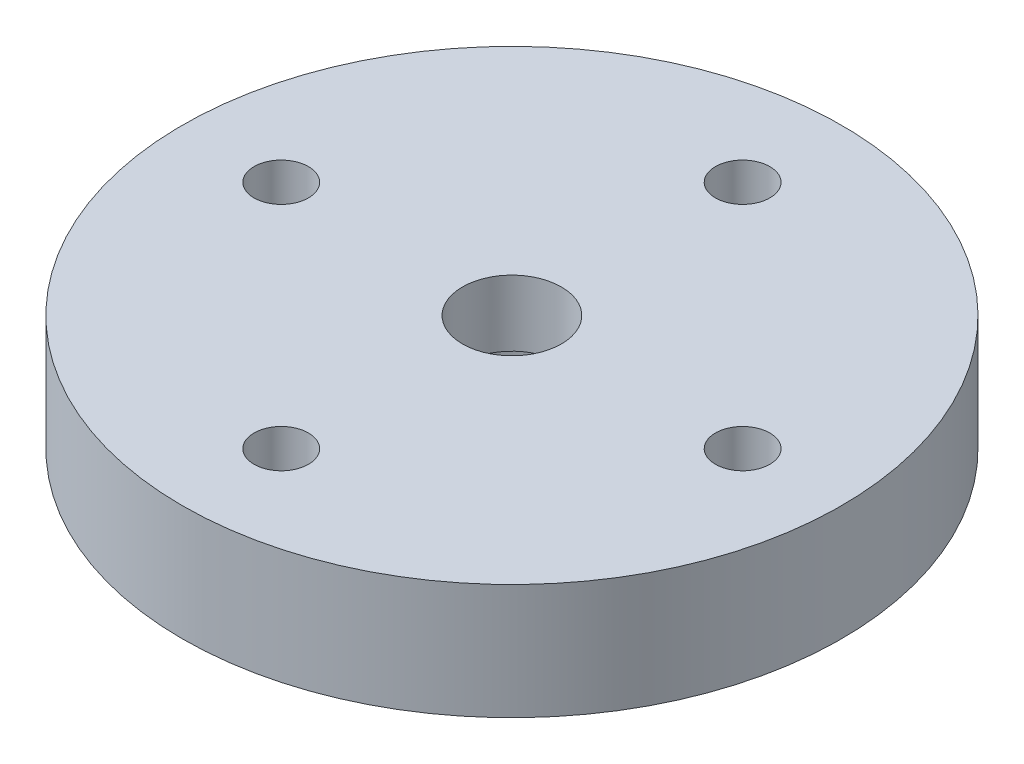
ISO-10303-21;
HEADER;
FILE_DESCRIPTION(('STEP AP214'),'2;1');
FILE_NAME('part.step','',(''),(''),'','','');
FILE_SCHEMA(('AUTOMOTIVE_DESIGN { 1 0 10303 214 1 1 1 1 }'));
ENDSEC;
DATA;
#1=APPLICATION_CONTEXT('core data for automotive mechanical design processes');
#2=APPLICATION_PROTOCOL_DEFINITION('international standard','automotive_design',2000,#1);
#3=PRODUCT_CONTEXT('',#1,'mechanical');
#4=PRODUCT('Part','Part','',(#3));
#5=PRODUCT_RELATED_PRODUCT_CATEGORY('part','',(#4));
#6=PRODUCT_DEFINITION_FORMATION('','',#4);
#7=PRODUCT_DEFINITION_CONTEXT('part definition',#1,'design');
#8=PRODUCT_DEFINITION('design','',#6,#7);
#9=PRODUCT_DEFINITION_SHAPE('','',#8);
#10=(LENGTH_UNIT() NAMED_UNIT(*) SI_UNIT(.MILLI.,.METRE.));
#11=(NAMED_UNIT(*) PLANE_ANGLE_UNIT() SI_UNIT($,.RADIAN.));
#12=(NAMED_UNIT(*) SI_UNIT($,.STERADIAN.) SOLID_ANGLE_UNIT());
#13=UNCERTAINTY_MEASURE_WITH_UNIT(LENGTH_MEASURE(1.E-05),#10,'distance_accuracy_value','');
#14=(GEOMETRIC_REPRESENTATION_CONTEXT(3) GLOBAL_UNCERTAINTY_ASSIGNED_CONTEXT((#13)) GLOBAL_UNIT_ASSIGNED_CONTEXT((#10,
#11,#12)) REPRESENTATION_CONTEXT('',''));
#15=CARTESIAN_POINT('',(0.,0.,0.));
#16=DIRECTION('',(0.,0.,1.));
#17=DIRECTION('',(1.,0.,0.));
#18=AXIS2_PLACEMENT_3D('',#15,#16,#17);
#19=CARTESIAN_POINT('',(0.,3.5,0.));
#20=DIRECTION('',(0.,-1.,0.));
#21=DIRECTION('',(0.,0.,-1.));
#22=AXIS2_PLACEMENT_3D('',#19,#20,#21);
#23=CYLINDRICAL_SURFACE('',#22,1.5);
#24=CARTESIAN_POINT('',(0.,3.5,0.));
#25=DIRECTION('',(0.,1.,0.));
#26=DIRECTION('',(0.,0.,1.));
#27=AXIS2_PLACEMENT_3D('',#24,#25,#26);
#28=CIRCLE('',#27,1.5);
#29=CARTESIAN_POINT('',(0.,3.5,1.5));
#30=VERTEX_POINT('',#29);
#31=EDGE_CURVE('E70',#30,#30,#28,.T.);
#32=ORIENTED_EDGE('',*,*,#31,.T.);
#33=EDGE_LOOP('',(#32));
#34=FACE_BOUND('',#33,.T.);
#35=CARTESIAN_POINT('',(0.,1.5,0.));
#36=DIRECTION('',(0.,-1.,0.));
#37=DIRECTION('',(0.,0.,-1.));
#38=AXIS2_PLACEMENT_3D('',#35,#36,#37);
#39=CIRCLE('',#38,1.5);
#40=CARTESIAN_POINT('',(0.,1.5,-1.5));
#41=VERTEX_POINT('',#40);
#42=EDGE_CURVE('E62',#41,#41,#39,.T.);
#43=ORIENTED_EDGE('',*,*,#42,.T.);
#44=EDGE_LOOP('',(#43));
#45=FACE_BOUND('',#44,.T.);
#46=ADVANCED_FACE('F43',(#34,#45),#23,.F.);
#47=CARTESIAN_POINT('',(0.,0.,0.));
#48=DIRECTION('',(0.,1.,0.));
#49=DIRECTION('',(0.,0.,1.));
#50=AXIS2_PLACEMENT_3D('',#47,#48,#49);
#51=PLANE('',#50);
#52=CARTESIAN_POINT('',(-7.,0.,0.));
#53=DIRECTION('',(0.,1.,0.));
#54=DIRECTION('',(0.,0.,1.));
#55=AXIS2_PLACEMENT_3D('',#52,#53,#54);
#56=CIRCLE('',#55,0.825);
#57=CARTESIAN_POINT('',(-7.,0.,0.824999999999927));
#58=VERTEX_POINT('',#57);
#59=EDGE_CURVE('E94',#58,#58,#56,.T.);
#60=ORIENTED_EDGE('',*,*,#59,.T.);
#61=EDGE_LOOP('',(#60));
#62=FACE_BOUND('',#61,.T.);
#63=CARTESIAN_POINT('',(0.,0.,7.));
#64=DIRECTION('',(0.,1.,0.));
#65=DIRECTION('',(0.,0.,1.));
#66=AXIS2_PLACEMENT_3D('',#63,#64,#65);
#67=CIRCLE('',#66,0.825);
#68=CARTESIAN_POINT('',(0.,0.,7.825));
#69=VERTEX_POINT('',#68);
#70=EDGE_CURVE('E88',#69,#69,#67,.T.);
#71=ORIENTED_EDGE('',*,*,#70,.T.);
#72=EDGE_LOOP('',(#71));
#73=FACE_BOUND('',#72,.T.);
#74=CARTESIAN_POINT('',(7.,0.,0.));
#75=DIRECTION('',(0.,1.,0.));
#76=DIRECTION('',(0.,0.,1.));
#77=AXIS2_PLACEMENT_3D('',#74,#75,#76);
#78=CIRCLE('',#77,0.825);
#79=CARTESIAN_POINT('',(7.,0.,0.825000000000024));
#80=VERTEX_POINT('',#79);
#81=EDGE_CURVE('E82',#80,#80,#78,.T.);
#82=ORIENTED_EDGE('',*,*,#81,.T.);
#83=EDGE_LOOP('',(#82));
#84=FACE_BOUND('',#83,.T.);
#85=CARTESIAN_POINT('',(0.,0.,-7.));
#86=DIRECTION('',(0.,1.,0.));
#87=DIRECTION('',(0.,0.,1.));
#88=AXIS2_PLACEMENT_3D('',#85,#86,#87);
#89=CIRCLE('',#88,0.825);
#90=CARTESIAN_POINT('',(0.,0.,-6.175));
#91=VERTEX_POINT('',#90);
#92=EDGE_CURVE('E76',#91,#91,#89,.T.);
#93=ORIENTED_EDGE('',*,*,#92,.T.);
#94=EDGE_LOOP('',(#93));
#95=FACE_BOUND('',#94,.T.);
#96=CARTESIAN_POINT('',(0.,0.,0.));
#97=DIRECTION('',(0.,1.,0.));
#98=DIRECTION('',(0.,0.,1.));
#99=AXIS2_PLACEMENT_3D('',#96,#97,#98);
#100=CIRCLE('',#99,10.);
#101=CARTESIAN_POINT('',(0.,0.,10.));
#102=VERTEX_POINT('',#101);
#103=EDGE_CURVE('E67',#102,#102,#100,.T.);
#104=ORIENTED_EDGE('',*,*,#103,.F.);
#105=EDGE_LOOP('',(#104));
#106=FACE_BOUND('',#105,.T.);
#107=CARTESIAN_POINT('',(0.,0.,0.));
#108=DIRECTION('',(0.,1.,0.));
#109=DIRECTION('',(0.,0.,1.));
#110=AXIS2_PLACEMENT_3D('',#107,#108,#109);
#111=CIRCLE('',#110,4.5);
#112=CARTESIAN_POINT('',(0.,0.,4.5));
#113=VERTEX_POINT('',#112);
#114=EDGE_CURVE('E55',#113,#113,#111,.F.);
#115=ORIENTED_EDGE('',*,*,#114,.F.);
#116=EDGE_LOOP('',(#115));
#117=FACE_BOUND('',#116,.T.);
#118=ADVANCED_FACE('F123',(#62,#73,#84,#95,#106,#117),#51,.F.);
#119=CARTESIAN_POINT('',(0.,3.5,0.));
#120=DIRECTION('',(0.,1.,0.));
#121=DIRECTION('',(0.,0.,1.));
#122=AXIS2_PLACEMENT_3D('',#119,#120,#121);
#123=PLANE('',#122);
#124=CARTESIAN_POINT('',(0.,3.5,7.));
#125=DIRECTION('',(0.,1.,0.));
#126=DIRECTION('',(0.,0.,1.));
#127=AXIS2_PLACEMENT_3D('',#124,#125,#126);
#128=CIRCLE('',#127,0.825);
#129=CARTESIAN_POINT('',(0.,3.5,7.825));
#130=VERTEX_POINT('',#129);
#131=EDGE_CURVE('E85',#130,#130,#128,.T.);
#132=ORIENTED_EDGE('',*,*,#131,.F.);
#133=EDGE_LOOP('',(#132));
#134=FACE_BOUND('',#133,.T.);
#135=CARTESIAN_POINT('',(0.,3.5,-7.));
#136=DIRECTION('',(0.,1.,0.));
#137=DIRECTION('',(0.,0.,1.));
#138=AXIS2_PLACEMENT_3D('',#135,#136,#137);
#139=CIRCLE('',#138,0.825);
#140=CARTESIAN_POINT('',(0.,3.5,-6.175));
#141=VERTEX_POINT('',#140);
#142=EDGE_CURVE('E75',#141,#141,#139,.T.);
#143=ORIENTED_EDGE('',*,*,#142,.F.);
#144=EDGE_LOOP('',(#143));
#145=FACE_BOUND('',#144,.T.);
#146=CARTESIAN_POINT('',(0.,3.5,0.));
#147=DIRECTION('',(0.,1.,0.));
#148=DIRECTION('',(0.,0.,1.));
#149=AXIS2_PLACEMENT_3D('',#146,#147,#148);
#150=CIRCLE('',#149,10.);
#151=CARTESIAN_POINT('',(0.,3.5,10.));
#152=VERTEX_POINT('',#151);
#153=EDGE_CURVE('E59',#152,#152,#150,.T.);
#154=ORIENTED_EDGE('',*,*,#153,.T.);
#155=EDGE_LOOP('',(#154));
#156=FACE_BOUND('',#155,.T.);
#157=ORIENTED_EDGE('',*,*,#31,.F.);
#158=EDGE_LOOP('',(#157));
#159=FACE_BOUND('',#158,.T.);
#160=CARTESIAN_POINT('',(7.,3.5,0.));
#161=DIRECTION('',(0.,1.,0.));
#162=DIRECTION('',(0.,0.,1.));
#163=AXIS2_PLACEMENT_3D('',#160,#161,#162);
#164=CIRCLE('',#163,0.825);
#165=CARTESIAN_POINT('',(7.,3.5,0.825000000000024));
#166=VERTEX_POINT('',#165);
#167=EDGE_CURVE('E79',#166,#166,#164,.T.);
#168=ORIENTED_EDGE('',*,*,#167,.F.);
#169=EDGE_LOOP('',(#168));
#170=FACE_BOUND('',#169,.T.);
#171=CARTESIAN_POINT('',(-7.,3.5,0.));
#172=DIRECTION('',(0.,1.,0.));
#173=DIRECTION('',(0.,0.,1.));
#174=AXIS2_PLACEMENT_3D('',#171,#172,#173);
#175=CIRCLE('',#174,0.825);
#176=CARTESIAN_POINT('',(-7.,3.5,0.824999999999927));
#177=VERTEX_POINT('',#176);
#178=EDGE_CURVE('E91',#177,#177,#175,.T.);
#179=ORIENTED_EDGE('',*,*,#178,.F.);
#180=EDGE_LOOP('',(#179));
#181=FACE_BOUND('',#180,.T.);
#182=ADVANCED_FACE('F129',(#134,#145,#156,#159,#170,#181),#123,.T.);
#183=CARTESIAN_POINT('',(0.,3.5,0.));
#184=DIRECTION('',(0.,-1.,0.));
#185=DIRECTION('',(0.,0.,-1.));
#186=AXIS2_PLACEMENT_3D('',#183,#184,#185);
#187=CYLINDRICAL_SURFACE('',#186,10.);
#188=ORIENTED_EDGE('',*,*,#153,.F.);
#189=EDGE_LOOP('',(#188));
#190=FACE_BOUND('',#189,.T.);
#191=ORIENTED_EDGE('',*,*,#103,.T.);
#192=EDGE_LOOP('',(#191));
#193=FACE_BOUND('',#192,.T.);
#194=ADVANCED_FACE('F138',(#190,#193),#187,.T.);
#195=CARTESIAN_POINT('',(0.,3.5,-7.));
#196=DIRECTION('',(0.,-1.,0.));
#197=DIRECTION('',(0.,0.,-1.));
#198=AXIS2_PLACEMENT_3D('',#195,#196,#197);
#199=CYLINDRICAL_SURFACE('',#198,0.825);
#200=ORIENTED_EDGE('',*,*,#142,.T.);
#201=EDGE_LOOP('',(#200));
#202=FACE_BOUND('',#201,.T.);
#203=ORIENTED_EDGE('',*,*,#92,.F.);
#204=EDGE_LOOP('',(#203));
#205=FACE_BOUND('',#204,.T.);
#206=ADVANCED_FACE('F135',(#202,#205),#199,.F.);
#207=CARTESIAN_POINT('',(7.,3.5,0.));
#208=DIRECTION('',(0.,-1.,0.));
#209=DIRECTION('',(0.,0.,-1.));
#210=AXIS2_PLACEMENT_3D('',#207,#208,#209);
#211=CYLINDRICAL_SURFACE('',#210,0.825);
#212=ORIENTED_EDGE('',*,*,#167,.T.);
#213=EDGE_LOOP('',(#212));
#214=FACE_BOUND('',#213,.T.);
#215=ORIENTED_EDGE('',*,*,#81,.F.);
#216=EDGE_LOOP('',(#215));
#217=FACE_BOUND('',#216,.T.);
#218=ADVANCED_FACE('F145',(#214,#217),#211,.F.);
#219=CARTESIAN_POINT('',(0.,3.5,7.));
#220=DIRECTION('',(0.,-1.,0.));
#221=DIRECTION('',(0.,0.,-1.));
#222=AXIS2_PLACEMENT_3D('',#219,#220,#221);
#223=CYLINDRICAL_SURFACE('',#222,0.825);
#224=ORIENTED_EDGE('',*,*,#131,.T.);
#225=EDGE_LOOP('',(#224));
#226=FACE_BOUND('',#225,.T.);
#227=ORIENTED_EDGE('',*,*,#70,.F.);
#228=EDGE_LOOP('',(#227));
#229=FACE_BOUND('',#228,.T.);
#230=ADVANCED_FACE('F165',(#226,#229),#223,.F.);
#231=CARTESIAN_POINT('',(-7.,3.5,0.));
#232=DIRECTION('',(0.,-1.,0.));
#233=DIRECTION('',(0.,0.,-1.));
#234=AXIS2_PLACEMENT_3D('',#231,#232,#233);
#235=CYLINDRICAL_SURFACE('',#234,0.825);
#236=ORIENTED_EDGE('',*,*,#178,.T.);
#237=EDGE_LOOP('',(#236));
#238=FACE_BOUND('',#237,.T.);
#239=ORIENTED_EDGE('',*,*,#59,.F.);
#240=EDGE_LOOP('',(#239));
#241=FACE_BOUND('',#240,.T.);
#242=ADVANCED_FACE('F162',(#238,#241),#235,.F.);
#243=CARTESIAN_POINT('',(0.,-2.,0.));
#244=DIRECTION('',(0.,-1.,0.));
#245=DIRECTION('',(0.,0.,-1.));
#246=AXIS2_PLACEMENT_3D('',#243,#244,#245);
#247=PLANE('',#246);
#248=CARTESIAN_POINT('',(0.,-2.,0.));
#249=DIRECTION('',(0.,-1.,0.));
#250=DIRECTION('',(0.,0.,-1.));
#251=AXIS2_PLACEMENT_3D('',#248,#249,#250);
#252=CIRCLE('',#251,3.5);
#253=CARTESIAN_POINT('',(0.,-2.,-3.5));
#254=VERTEX_POINT('',#253);
#255=EDGE_CURVE('E10',#254,#254,#252,.F.);
#256=ORIENTED_EDGE('',*,*,#255,.T.);
#257=EDGE_LOOP('',(#256));
#258=FACE_BOUND('',#257,.T.);
#259=CARTESIAN_POINT('',(0.,-2.,0.));
#260=DIRECTION('',(0.,-1.,0.));
#261=DIRECTION('',(0.,0.,-1.));
#262=AXIS2_PLACEMENT_3D('',#259,#260,#261);
#263=CIRCLE('',#262,4.5);
#264=CARTESIAN_POINT('',(0.,-2.,-4.5));
#265=VERTEX_POINT('',#264);
#266=EDGE_CURVE('E64',#265,#265,#263,.T.);
#267=ORIENTED_EDGE('',*,*,#266,.T.);
#268=EDGE_LOOP('',(#267));
#269=FACE_BOUND('',#268,.T.);
#270=ADVANCED_FACE('F118',(#258,#269),#247,.T.);
#271=CARTESIAN_POINT('',(0.,-2.,0.));
#272=DIRECTION('',(0.,1.,0.));
#273=DIRECTION('',(0.,0.,1.));
#274=AXIS2_PLACEMENT_3D('',#271,#272,#273);
#275=CYLINDRICAL_SURFACE('',#274,4.5);
#276=ORIENTED_EDGE('',*,*,#266,.F.);
#277=EDGE_LOOP('',(#276));
#278=FACE_BOUND('',#277,.T.);
#279=ORIENTED_EDGE('',*,*,#114,.T.);
#280=EDGE_LOOP('',(#279));
#281=FACE_BOUND('',#280,.T.);
#282=ADVANCED_FACE('F108',(#278,#281),#275,.T.);
#283=CARTESIAN_POINT('',(0.,1.5,0.));
#284=DIRECTION('',(0.,-1.,0.));
#285=DIRECTION('',(0.,0.,-1.));
#286=AXIS2_PLACEMENT_3D('',#283,#284,#285);
#287=CYLINDRICAL_SURFACE('',#286,3.);
#288=CARTESIAN_POINT('',(0.,-1.5,0.));
#289=DIRECTION('',(0.,-1.,0.));
#290=DIRECTION('',(0.,0.,-1.));
#291=AXIS2_PLACEMENT_3D('',#288,#289,#290);
#292=CIRCLE('',#291,3.);
#293=CARTESIAN_POINT('',(0.,-1.5,-3.));
#294=VERTEX_POINT('',#293);
#295=EDGE_CURVE('E51',#294,#294,#292,.T.);
#296=ORIENTED_EDGE('',*,*,#295,.T.);
#297=EDGE_LOOP('',(#296));
#298=FACE_BOUND('',#297,.T.);
#299=CARTESIAN_POINT('',(0.,1.5,0.));
#300=DIRECTION('',(0.,-1.,0.));
#301=DIRECTION('',(0.,0.,-1.));
#302=AXIS2_PLACEMENT_3D('',#299,#300,#301);
#303=CIRCLE('',#302,3.);
#304=CARTESIAN_POINT('',(0.,1.5,-3.));
#305=VERTEX_POINT('',#304);
#306=EDGE_CURVE('E65',#305,#305,#303,.T.);
#307=ORIENTED_EDGE('',*,*,#306,.F.);
#308=EDGE_LOOP('',(#307));
#309=FACE_BOUND('',#308,.T.);
#310=ADVANCED_FACE('F106',(#298,#309),#287,.F.);
#311=CARTESIAN_POINT('',(0.,1.5,0.));
#312=DIRECTION('',(0.,-1.,0.));
#313=DIRECTION('',(0.,0.,-1.));
#314=AXIS2_PLACEMENT_3D('',#311,#312,#313);
#315=PLANE('',#314);
#316=ORIENTED_EDGE('',*,*,#42,.F.);
#317=EDGE_LOOP('',(#316));
#318=FACE_BOUND('',#317,.T.);
#319=ORIENTED_EDGE('',*,*,#306,.T.);
#320=EDGE_LOOP('',(#319));
#321=FACE_BOUND('',#320,.T.);
#322=ADVANCED_FACE('F104',(#318,#321),#315,.T.);
#323=CARTESIAN_POINT('',(0.,-1.5,0.));
#324=DIRECTION('',(0.,-1.,0.));
#325=DIRECTION('',(0.,0.,-1.));
#326=AXIS2_PLACEMENT_3D('',#323,#324,#325);
#327=CONICAL_SURFACE('',#326,3.,0.785398163397448);
#328=ORIENTED_EDGE('',*,*,#255,.F.);
#329=EDGE_LOOP('',(#328));
#330=FACE_BOUND('',#329,.T.);
#331=ORIENTED_EDGE('',*,*,#295,.F.);
#332=EDGE_LOOP('',(#331));
#333=FACE_BOUND('',#332,.T.);
#334=ADVANCED_FACE('F46',(#330,#333),#327,.F.);
#335=CLOSED_SHELL('',(#46,#118,#182,#194,#206,#218,#230,#242,#270,#282,#310,#322,#334));
#336=MANIFOLD_SOLID_BREP('B2',#335);
#337=ADVANCED_BREP_SHAPE_REPRESENTATION('',(#18,#336),#14);
#338=SHAPE_DEFINITION_REPRESENTATION(#9,#337);
ENDSEC;
END-ISO-10303-21;
